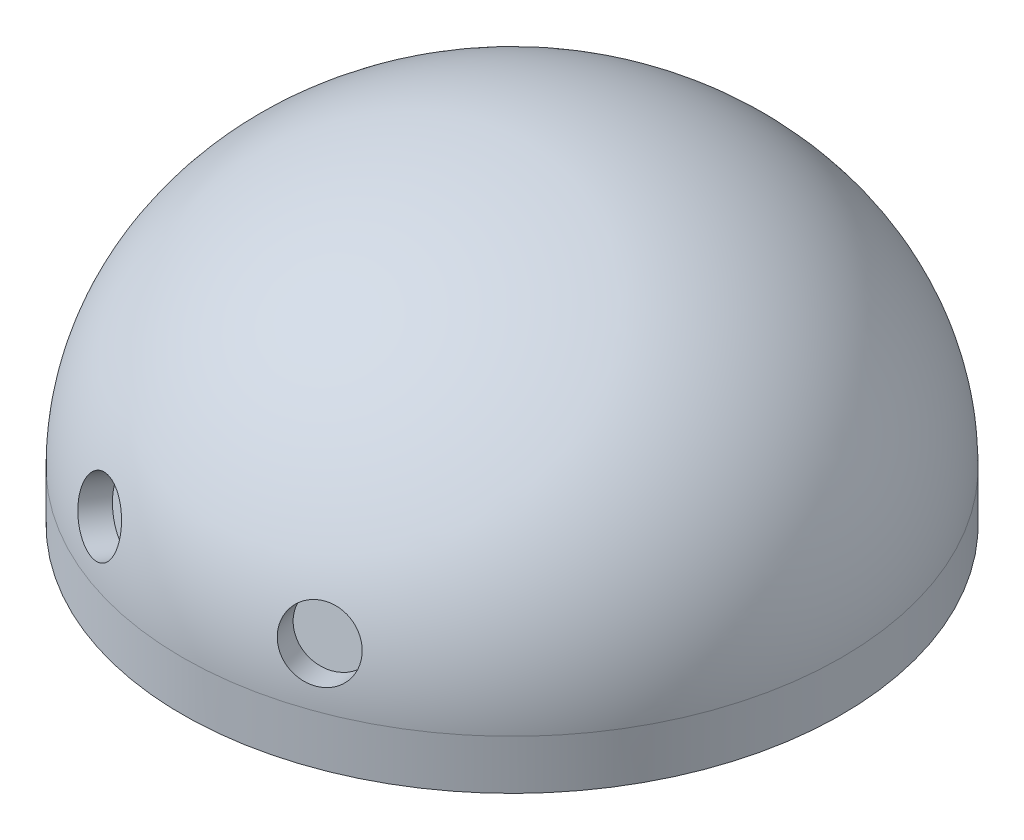
ISO-10303-21;
HEADER;
FILE_DESCRIPTION(('STEP AP214'),'2;1');
FILE_NAME('part.step','',(''),(''),'','','');
FILE_SCHEMA(('AUTOMOTIVE_DESIGN { 1 0 10303 214 1 1 1 1 }'));
ENDSEC;
DATA;
#1=APPLICATION_CONTEXT('core data for automotive mechanical design processes');
#2=APPLICATION_PROTOCOL_DEFINITION('international standard','automotive_design',2000,#1);
#3=PRODUCT_CONTEXT('',#1,'mechanical');
#4=PRODUCT('Part','Part','',(#3));
#5=PRODUCT_RELATED_PRODUCT_CATEGORY('part','',(#4));
#6=PRODUCT_DEFINITION_FORMATION('','',#4);
#7=PRODUCT_DEFINITION_CONTEXT('part definition',#1,'design');
#8=PRODUCT_DEFINITION('design','',#6,#7);
#9=PRODUCT_DEFINITION_SHAPE('','',#8);
#10=(LENGTH_UNIT() NAMED_UNIT(*) SI_UNIT(.MILLI.,.METRE.));
#11=(NAMED_UNIT(*) PLANE_ANGLE_UNIT() SI_UNIT($,.RADIAN.));
#12=(NAMED_UNIT(*) SI_UNIT($,.STERADIAN.) SOLID_ANGLE_UNIT());
#13=UNCERTAINTY_MEASURE_WITH_UNIT(LENGTH_MEASURE(1.E-05),#10,'distance_accuracy_value','');
#14=(GEOMETRIC_REPRESENTATION_CONTEXT(3) GLOBAL_UNCERTAINTY_ASSIGNED_CONTEXT((#13)) GLOBAL_UNIT_ASSIGNED_CONTEXT((#10,
#11,#12)) REPRESENTATION_CONTEXT('',''));
#15=CARTESIAN_POINT('',(0.,0.,0.));
#16=DIRECTION('',(0.,0.,1.));
#17=DIRECTION('',(1.,0.,0.));
#18=AXIS2_PLACEMENT_3D('',#15,#16,#17);
#19=CARTESIAN_POINT('',(0.,0.,0.));
#20=DIRECTION('',(0.,0.,1.));
#21=DIRECTION('',(-1.,0.,0.));
#22=AXIS2_PLACEMENT_3D('',#19,#20,#21);
#23=ELLIPSE('',#22,20.,17.);
#24=TRIMMED_CURVE('',#23,(PARAMETER_VALUE(1.5707963267949)),(PARAMETER_VALUE(4.71238898038469)),
.T.,.PARAMETER.);
#25=CARTESIAN_POINT('',(0.,26.6773564906992,0.));
#26=DIRECTION('',(0.,1.,0.));
#27=AXIS1_PLACEMENT('',#25,#26);
#28=SURFACE_OF_REVOLUTION('',#24,#27);
#29=CARTESIAN_POINT('',(-4.80098950316845,3.23633692495747,19.0382190513201));
#30=CARTESIAN_POINT('',(-4.80959540317422,3.12667561615685,19.0618491943308));
#31=CARTESIAN_POINT('',(-4.82699783108092,3.01685802759355,19.0819314643858));
#32=CARTESIAN_POINT('',(-4.87896923787384,2.80009315749065,19.1144177679186));
#33=CARTESIAN_POINT('',(-4.91355816951812,2.69314936477069,19.1268128392135));
#34=CARTESIAN_POINT('',(-4.99895945219169,2.48531823522831,19.1436156205902));
#35=CARTESIAN_POINT('',(-5.04976544014632,2.3844285413778,19.1480264589191));
#36=CARTESIAN_POINT('',(-5.16620453013257,2.19160241980392,19.1488556132407));
#37=CARTESIAN_POINT('',(-5.23183402334872,2.09966382069961,19.1452758726767));
#38=CARTESIAN_POINT('',(-5.37604174479478,1.92746208288544,19.1303856960292));
#39=CARTESIAN_POINT('',(-5.45460548764444,1.84718607016551,19.1190838639983));
#40=CARTESIAN_POINT('',(-5.62256710888655,1.70050711895076,19.0892398674682));
#41=CARTESIAN_POINT('',(-5.71196536103795,1.63410465926839,19.070697453141));
#42=CARTESIAN_POINT('',(-5.89905002658007,1.51713736052638,19.0270705320031));
#43=CARTESIAN_POINT('',(-5.99673102689248,1.46656227755381,19.0019902760133));
#44=CARTESIAN_POINT('',(-6.1977067148132,1.38265504704791,18.9461275632921));
#45=CARTESIAN_POINT('',(-6.30100138929607,1.34932285920048,18.9153451198926));
#46=CARTESIAN_POINT('',(-6.51030403472964,1.30086702001827,18.8490473313743));
#47=CARTESIAN_POINT('',(-6.61631193973145,1.28574292653855,18.8135321012044));
#48=CARTESIAN_POINT('',(-6.82805060211161,1.27413975370741,18.7388209621598));
#49=CARTESIAN_POINT('',(-6.93378135986938,1.27766064881692,18.6996250583267));
#50=CARTESIAN_POINT('',(-7.14196666092716,1.30324613545661,18.6186523671144));
#51=CARTESIAN_POINT('',(-7.24442102747307,1.32531172568644,18.5768754408499));
#52=CARTESIAN_POINT('',(-7.44311563697539,1.38734891657614,18.4918641283314));
#53=CARTESIAN_POINT('',(-7.53935587582237,1.42732052907719,18.4486297411136));
#54=CARTESIAN_POINT('',(-7.7228469054888,1.5240111118677,18.3618213130276));
#55=CARTESIAN_POINT('',(-7.81009794318364,1.58072962206236,18.3182472815226));
#56=CARTESIAN_POINT('',(-7.97308422617122,1.709272938722,18.2318509950134));
#57=CARTESIAN_POINT('',(-8.0488194958063,1.78109771325419,18.1890287384203));
#58=CARTESIAN_POINT('',(-8.18656472760909,1.93777339872484,18.1051915639556));
#59=CARTESIAN_POINT('',(-8.2485753431043,2.02262368929075,18.0641765601287));
#60=CARTESIAN_POINT('',(-8.35706403627015,2.2029044701538,17.9849540249972));
#61=CARTESIAN_POINT('',(-8.40354212302428,2.29833495426359,17.9467464920507));
#62=CARTESIAN_POINT('',(-8.47962031967518,2.49706284718879,17.8740669211108));
#63=CARTESIAN_POINT('',(-8.50921511121206,2.60036272331678,17.8395960629634));
#64=CARTESIAN_POINT('',(-8.55064464821126,2.81184480119984,17.7752693431589));
#65=CARTESIAN_POINT('',(-8.56247928989088,2.92002703148149,17.7454135084709));
#66=CARTESIAN_POINT('',(-8.56805693476744,3.1383366961746,17.6910600953594));
#67=CARTESIAN_POINT('',(-8.56177658410125,3.24846645950148,17.6665694775565));
#68=CARTESIAN_POINT('',(-8.5312703392749,3.46741794287104,17.6236743063997));
#69=CARTESIAN_POINT('',(-8.50704419536231,3.57623964468796,17.605269837752));
#70=CARTESIAN_POINT('',(-8.44129144533647,3.7897454242458,17.5750756209244));
#71=CARTESIAN_POINT('',(-8.3997278973306,3.89442014112061,17.5633001241497));
#72=CARTESIAN_POINT('',(-8.30051232073934,4.09644777214587,17.5468519608923));
#73=CARTESIAN_POINT('',(-8.24286009661763,4.19380059729026,17.5421793807404));
#74=CARTESIAN_POINT('',(-8.11304984342132,4.37858574153657,17.5402057977305));
#75=CARTESIAN_POINT('',(-8.04087202170919,4.46600426701914,17.5429149170586));
#76=CARTESIAN_POINT('',(-7.88415026794589,4.62830732330704,17.5558171991381));
#77=CARTESIAN_POINT('',(-7.79960638321813,4.70319190207589,17.5660103332498));
#78=CARTESIAN_POINT('',(-7.62072173004331,4.83821620680083,17.5937490504916));
#79=CARTESIAN_POINT('',(-7.52639448886805,4.89837591560588,17.6112845807438));
#80=CARTESIAN_POINT('',(-7.33057693306861,5.00236840743723,17.6533722604964));
#81=CARTESIAN_POINT('',(-7.22908679305929,5.04620158830301,17.6779242389966));
#82=CARTESIAN_POINT('',(-7.02229510927559,5.11614305696886,17.7333643783293));
#83=CARTESIAN_POINT('',(-6.91701018417323,5.14232059931736,17.7642271563024));
#84=CARTESIAN_POINT('',(-6.70528450219197,5.17647440500713,17.8315498838362));
#85=CARTESIAN_POINT('',(-6.59884377105463,5.18445107287734,17.8680097089788));
#86=CARTESIAN_POINT('',(-6.3882363448893,5.18197803164763,17.9453710065624));
#87=CARTESIAN_POINT('',(-6.28406292993618,5.1715934967934,17.986256287202));
#88=CARTESIAN_POINT('',(-6.08054873822629,5.13282272232573,18.071379039537));
#89=CARTESIAN_POINT('',(-5.98120795413376,5.10443651003914,18.1156165061435));
#90=CARTESIAN_POINT('',(-5.79013613802305,5.03047278684316,18.2061049471179));
#91=CARTESIAN_POINT('',(-5.69840516668595,4.98489513886434,18.2523559375373));
#92=CARTESIAN_POINT('',(-5.52508271363666,4.87784023617426,18.345439758798));
#93=CARTESIAN_POINT('',(-5.44349102873356,4.81636330016024,18.392272577959));
#94=CARTESIAN_POINT('',(-5.29239995591901,4.67899751488044,18.4852154009012));
#95=CARTESIAN_POINT('',(-5.22294278859841,4.60306019480796,18.5313223922479));
#96=CARTESIAN_POINT('',(-5.09832000796762,4.43900975759113,18.6212044186813));
#97=CARTESIAN_POINT('',(-5.04315822097547,4.35089339024613,18.6649788269405));
#98=CARTESIAN_POINT('',(-4.94841628251511,4.16455123333564,18.7489852268321));
#99=CARTESIAN_POINT('',(-4.9089061491576,4.06628244117918,18.7892006887642));
#100=CARTESIAN_POINT('',(-4.84691756956675,3.86278351547748,18.8645704688974));
#101=CARTESIAN_POINT('',(-4.82441919971493,3.75756168271703,18.8997306684314));
#102=CARTESIAN_POINT('',(-4.80201542294444,3.58246551446891,18.9521539668904));
#103=CARTESIAN_POINT('',(-4.79685261126114,3.51376390359411,18.9712546963289));
#104=CARTESIAN_POINT('',(-4.79360797183475,3.3755081655647,19.0067865900429));
#105=CARTESIAN_POINT('',(-4.7955261550444,3.3059540370916,19.0232177501892));
#106=CARTESIAN_POINT('',(-4.80098950316845,3.23633692495747,19.0382190513201));
#107=B_SPLINE_CURVE_WITH_KNOTS('',3,(#29,#30,#31,#32,#33,#34,#35,#36,#37,#38,#39,#40,#41,#42,
#43,#44,#45,#46,#47,#48,#49,#50,#51,#52,#53,#54,#55,#56,#57,#58,#59,#60,#61,#62,#63,#64,#65,#66,
#67,#68,#69,#70,#71,#72,#73,#74,#75,#76,#77,#78,#79,#80,#81,#82,#83,#84,#85,#86,#87,#88,#89,#90,
#91,#92,#93,#94,#95,#96,#97,#98,#99,#100,#101,#102,#103,#104,#105,#106),.UNSPECIFIED.,.T.,.F.,
(4,2,2,2,2,2,2,2,2,2,2,2,2,2,2,2,2,2,2,2,2,2,2,2,2,2,2,2,2,2,2,2,2,2,2,2,2,2,4),(0.,
0.337264104454084,0.674920675446971,1.01244492289715,1.34988708771531,1.68695388199132,
2.02403230739951,2.36089211301792,2.69775113105042,3.03460196901134,3.37145234556897,
3.7083208639136,4.04518960502851,4.38204909206334,4.71890786702564,5.05575060322634,
5.39259314244007,5.72954173097837,6.0664922884917,6.40387743702274,6.74126728104665,
7.0793797249679,7.4174962783723,7.75607670875897,8.09465584347413,8.43277291892214,
8.77088175470482,9.10765651723914,9.44442379461311,9.77999809394602,10.1155718838731,
10.4511483494281,10.7867180889585,11.1234331055888,11.4602381548827,11.7985333416567,
12.1364317119188,12.3505392847543,12.5646471887671),.UNSPECIFIED.);
#108=CARTESIAN_POINT('',(-4.80098950316845,3.23633692495747,19.0382190513201));
#109=VERTEX_POINT('',#108);
#110=EDGE_CURVE('E41',#109,#109,#107,.T.);
#111=ORIENTED_EDGE('',*,*,#110,.T.);
#112=EDGE_LOOP('',(#111));
#113=FACE_BOUND('',#112,.T.);
#114=CARTESIAN_POINT('',(0.,17.,0.));
#115=VERTEX_POINT('',#114);
#116=VERTEX_LOOP('',#115);
#117=FACE_BOUND('',#116,.T.);
#118=CARTESIAN_POINT('',(0.,0.,0.));
#119=DIRECTION('',(0.,-1.,0.));
#120=DIRECTION('',(0.,0.,-1.));
#121=AXIS2_PLACEMENT_3D('',#118,#119,#120);
#122=CIRCLE('',#121,20.);
#123=CARTESIAN_POINT('',(0.,0.,-20.));
#124=VERTEX_POINT('',#123);
#125=EDGE_CURVE('E48',#124,#124,#122,.T.);
#126=ORIENTED_EDGE('',*,*,#125,.F.);
#127=EDGE_LOOP('',(#126));
#128=FACE_BOUND('',#127,.T.);
#129=CARTESIAN_POINT('',(8.55975998631208,3.23633692495747,17.6701384780174));
#130=CARTESIAN_POINT('',(8.55112927809442,3.34630929284993,17.6464403653938));
#131=CARTESIAN_POINT('',(8.53341569743245,3.45628215086244,17.6256614947852));
#132=CARTESIAN_POINT('',(8.48031590063016,3.67304455997559,17.590580980276));
#133=CARTESIAN_POINT('',(8.44490820222992,3.77983007393635,17.576287250268));
#134=CARTESIAN_POINT('',(8.3574774730034,3.9870670349617,17.5546884554913));
#135=CARTESIAN_POINT('',(8.30546306039846,4.08752173515922,17.5473797736006));
#136=CARTESIAN_POINT('',(8.18634340969437,4.2793007136014,17.5400732592973));
#137=CARTESIAN_POINT('',(8.11924190601367,4.3706272432211,17.5400736197084));
#138=CARTESIAN_POINT('',(7.97184659296114,4.54166310903569,17.5475402976013));
#139=CARTESIAN_POINT('',(7.89154619329334,4.62136660406212,17.5550103542724));
#140=CARTESIAN_POINT('',(7.72009692906656,4.76685411693606,17.5773868733833));
#141=CARTESIAN_POINT('',(7.62894775365841,4.83263773578829,17.592293548943));
#142=CARTESIAN_POINT('',(7.43867065775511,4.94827314074961,17.629246532952));
#143=CARTESIAN_POINT('',(7.33956220473779,4.99816240099378,17.6512757974156));
#144=CARTESIAN_POINT('',(7.13604517273159,5.08079388096732,17.7020015195663));
#145=CARTESIAN_POINT('',(7.03163674350444,5.11353658491238,17.7306977889452));
#146=CARTESIAN_POINT('',(6.82098909589844,5.16083107021719,17.7939036895879));
#147=CARTESIAN_POINT('',(6.71475947377887,5.1754591067068,17.8283882529116));
#148=CARTESIAN_POINT('',(6.50308879009155,5.18635608175249,17.9023176849766));
#149=CARTESIAN_POINT('',(6.39764771204886,5.18262540495338,17.9417624497766));
#150=CARTESIAN_POINT('',(6.19083497484809,5.15694778141336,18.0243639874354));
#151=CARTESIAN_POINT('',(6.08945326135455,5.13504919027714,18.0675106343681));
#152=CARTESIAN_POINT('',(5.89330795902842,5.07372498941664,18.1563155779785));
#153=CARTESIAN_POINT('',(5.79854440672582,5.03429928295749,18.2019738885173));
#154=CARTESIAN_POINT('',(5.61814144143331,4.9389773877253,18.2944606972607));
#155=CARTESIAN_POINT('',(5.53251404836572,4.88305985676552,18.3412906393662));
#156=CARTESIAN_POINT('',(5.37286322196202,4.75634835318188,18.4346016595438));
#157=CARTESIAN_POINT('',(5.29884004430351,4.68555405285609,18.4810827299076));
#158=CARTESIAN_POINT('',(5.16411975198203,4.53074932257937,18.5724206878891));
#159=CARTESIAN_POINT('',(5.1034779793104,4.44668638574274,18.6172702125613));
#160=CARTESIAN_POINT('',(4.9975349754279,4.26790088626344,18.703725100895));
#161=CARTESIAN_POINT('',(4.95223406157038,4.1731781031566,18.7453303974301));
#162=CARTESIAN_POINT('',(4.87806151344166,3.97537745196328,18.8241201920181));
#163=CARTESIAN_POINT('',(4.84924566982312,3.87227254473113,18.8612893448953));
#164=CARTESIAN_POINT('',(4.80905936766319,3.66088125730855,18.9298820706926));
#165=CARTESIAN_POINT('',(4.7976889804716,3.55259485592829,18.9613056201134));
#166=CARTESIAN_POINT('',(4.7927062210593,3.33384906410547,19.0174621005141));
#167=CARTESIAN_POINT('',(4.79910137824493,3.22338877202133,19.0421921897924));
#168=CARTESIAN_POINT('',(4.82950159305786,3.00348252015817,19.0842247825943));
#169=CARTESIAN_POINT('',(4.85350648567941,2.89403655088452,19.1015273557124));
#170=CARTESIAN_POINT('',(4.91841981031802,2.67949271828915,19.1282252529755));
#171=CARTESIAN_POINT('',(4.95929717041724,2.57438725097181,19.1376350162398));
#172=CARTESIAN_POINT('',(5.05684151987301,2.37133470491363,19.1484207375639));
#173=CARTESIAN_POINT('',(5.11350833664283,2.2733875479436,19.1497967834326));
#174=CARTESIAN_POINT('',(5.24094948734891,2.08766763769706,19.1446101367496));
#175=CARTESIAN_POINT('',(5.31169560225233,1.99987507939896,19.1380631929269));
#176=CARTESIAN_POINT('',(5.46541818971351,1.83677667326187,19.1173973183714));
#177=CARTESIAN_POINT('',(5.54839460186325,1.76147076375259,19.1032784250373));
#178=CARTESIAN_POINT('',(5.72419597951362,1.62559102580799,19.0680490510578));
#179=CARTESIAN_POINT('',(5.81701153995388,1.56500330769772,19.04694520696));
#180=CARTESIAN_POINT('',(6.0099757634624,1.46022073165664,18.99849171165));
#181=CARTESIAN_POINT('',(6.11012441155149,1.41602584024159,18.9711420731959));
#182=CARTESIAN_POINT('',(6.31494032456792,1.34531358963673,18.9110983487516));
#183=CARTESIAN_POINT('',(6.41960694389294,1.31879371359445,18.8784050245071));
#184=CARTESIAN_POINT('',(6.6305293376825,1.28418918474635,18.8086757957119));
#185=CARTESIAN_POINT('',(6.73678511547949,1.2761045706046,18.7716398820535));
#186=CARTESIAN_POINT('',(6.94788472718725,1.278604890463,18.6942984799445));
#187=CARTESIAN_POINT('',(7.05272847763701,1.28919092319557,18.6539927992073));
#188=CARTESIAN_POINT('',(7.25801025140401,1.32872813478487,18.5712263893355));
#189=CARTESIAN_POINT('',(7.35844826597479,1.35767935009925,18.5287656559229));
#190=CARTESIAN_POINT('',(7.55203851972821,1.43310924169361,18.4428106112993));
#191=CARTESIAN_POINT('',(7.64519062231531,1.47958824648777,18.3993162807305));
#192=CARTESIAN_POINT('',(7.82151307268747,1.58872618413935,18.3124060031481));
#193=CARTESIAN_POINT('',(7.90468382116393,1.65138446717745,18.2689900530571));
#194=CARTESIAN_POINT('',(8.05861913280082,1.79105647958825,18.1833215545714));
#195=CARTESIAN_POINT('',(8.12938575321151,1.86806782409627,18.1410688142379));
#196=CARTESIAN_POINT('',(8.25648145596624,2.03425246928503,18.0587432806222));
#197=CARTESIAN_POINT('',(8.31280700985365,2.12342873414155,18.0186710219885));
#198=CARTESIAN_POINT('',(8.40938036822938,2.31140103422042,17.9416779520488));
#199=CARTESIAN_POINT('',(8.44961837516267,2.41020288615905,17.9047590719258));
#200=CARTESIAN_POINT('',(8.51275590926922,2.61447066004417,17.8350427985725));
#201=CARTESIAN_POINT('',(8.53567593785966,2.7199285415982,17.802240570457));
#202=CARTESIAN_POINT('',(8.5583875896391,2.89442870842842,17.7528946413004));
#203=CARTESIAN_POINT('',(8.56361605128094,2.96239027262053,17.7348485973259));
#204=CARTESIAN_POINT('',(8.56699656158374,3.09901346943209,17.7008685365715));
#205=CARTESIAN_POINT('',(8.56514861414542,3.16767510166561,17.6849345186274));
#206=CARTESIAN_POINT('',(8.55975998631208,3.23633692495747,17.6701384780174));
#207=B_SPLINE_CURVE_WITH_KNOTS('',3,(#129,#130,#131,#132,#133,#134,#135,#136,#137,#138,#139,
#140,#141,#142,#143,#144,#145,#146,#147,#148,#149,#150,#151,#152,#153,#154,#155,#156,#157,#158,
#159,#160,#161,#162,#163,#164,#165,#166,#167,#168,#169,#170,#171,#172,#173,#174,#175,#176,#177,
#178,#179,#180,#181,#182,#183,#184,#185,#186,#187,#188,#189,#190,#191,#192,#193,#194,#195,#196,
#197,#198,#199,#200,#201,#202,#203,#204,#205,#206),.UNSPECIFIED.,.T.,.F.,(4,2,2,2,2,2,2,2,2,2,2,
2,2,2,2,2,2,2,2,2,2,2,2,2,2,2,2,2,2,2,2,2,2,2,2,2,2,2,4),(0.,0.338224585015618,
0.676860806578078,1.01532157434485,1.35369865696897,1.69224520962233,2.03080146496135,
2.3685534954491,2.70629598736523,3.04261183851876,3.37892064333982,3.71433719171706,
4.04975559133338,4.38560997726873,4.72147176210002,5.05869758002844,5.39593037365537,
5.73429781808104,6.07266664638526,6.41117890429676,6.74968799034042,7.08757644825269,
7.42546121301829,7.76267545731497,8.09988803609525,8.43678113751925,8.77367355079657,
9.11051798166798,9.44736311899856,9.78422807969267,10.1210937091166,10.4579656525506,
10.7948240680725,11.1316265619583,11.4685112701935,11.8056008348325,12.1422907172282,
12.3534631229478,12.5646354122634),.UNSPECIFIED.);
#208=CARTESIAN_POINT('',(8.55975998631208,3.23633692495747,17.6701384780174));
#209=VERTEX_POINT('',#208);
#210=EDGE_CURVE('E61',#209,#209,#207,.T.);
#211=ORIENTED_EDGE('',*,*,#210,.F.);
#212=EDGE_LOOP('',(#211));
#213=FACE_BOUND('',#212,.T.);
#214=ADVANCED_FACE('F36',(#113,#117,#128,#213),#28,.T.);
#215=CARTESIAN_POINT('',(0.,-3.,0.));
#216=DIRECTION('',(0.,1.,0.));
#217=DIRECTION('',(0.,0.,1.));
#218=AXIS2_PLACEMENT_3D('',#215,#216,#217);
#219=CYLINDRICAL_SURFACE('',#218,20.);
#220=CARTESIAN_POINT('',(0.,-3.,0.));
#221=DIRECTION('',(0.,-1.,0.));
#222=DIRECTION('',(0.,0.,-1.));
#223=AXIS2_PLACEMENT_3D('',#220,#221,#222);
#224=CIRCLE('',#223,20.);
#225=CARTESIAN_POINT('',(0.,-3.,-20.));
#226=VERTEX_POINT('',#225);
#227=EDGE_CURVE('E11',#226,#226,#224,.T.);
#228=ORIENTED_EDGE('',*,*,#227,.F.);
#229=EDGE_LOOP('',(#228));
#230=FACE_BOUND('',#229,.T.);
#231=ORIENTED_EDGE('',*,*,#125,.T.);
#232=EDGE_LOOP('',(#231));
#233=FACE_BOUND('',#232,.T.);
#234=ADVANCED_FACE('F54',(#230,#233),#219,.T.);
#235=CARTESIAN_POINT('',(0.,-3.,0.));
#236=DIRECTION('',(0.,-1.,0.));
#237=DIRECTION('',(0.,0.,-1.));
#238=AXIS2_PLACEMENT_3D('',#235,#236,#237);
#239=PLANE('',#238);
#240=ORIENTED_EDGE('',*,*,#227,.T.);
#241=EDGE_LOOP('',(#240));
#242=FACE_BOUND('',#241,.T.);
#243=ADVANCED_FACE('F77',(#242),#239,.T.);
#244=CARTESIAN_POINT('',(6.13305046392286,2.97118327001772,16.8504176620037));
#245=DIRECTION('',(0.337419706756525,0.163464460888851,0.92705302519255));
#246=DIRECTION('',(0.939692620785908,0.,-0.34202014332567));
#247=AXIS2_PLACEMENT_3D('',#244,#245,#246);
#248=CYLINDRICAL_SURFACE('',#247,2.);
#249=CARTESIAN_POINT('',(6.13305046392286,2.97118327001772,16.8504176620037));
#250=DIRECTION('',(-0.337419706756525,-0.163464460888851,-0.92705302519255));
#251=DIRECTION('',(-0.939692620785908,0.,0.34202014332567));
#252=AXIS2_PLACEMENT_3D('',#249,#250,#251);
#253=CIRCLE('',#252,2.);
#254=CARTESIAN_POINT('',(4.25366522235105,2.97118327001772,17.534457948655));
#255=VERTEX_POINT('',#254);
#256=EDGE_CURVE('E63',#255,#255,#253,.T.);
#257=ORIENTED_EDGE('',*,*,#256,.T.);
#258=EDGE_LOOP('',(#257));
#259=FACE_BOUND('',#258,.T.);
#260=ORIENTED_EDGE('',*,*,#210,.T.);
#261=EDGE_LOOP('',(#260));
#262=FACE_BOUND('',#261,.T.);
#263=ADVANCED_FACE('F71',(#259,#262),#248,.F.);
#264=CARTESIAN_POINT('',(6.13305046392286,2.97118327001772,16.8504176620037));
#265=DIRECTION('',(-0.337419706756525,-0.163464460888851,-0.92705302519255));
#266=DIRECTION('',(-0.939692620785908,0.,0.34202014332567));
#267=AXIS2_PLACEMENT_3D('',#264,#265,#266);
#268=PLANE('',#267);
#269=ORIENTED_EDGE('',*,*,#256,.F.);
#270=EDGE_LOOP('',(#269));
#271=FACE_BOUND('',#270,.T.);
#272=ADVANCED_FACE('F76',(#271),#268,.F.);
#273=CARTESIAN_POINT('',(-6.13305046392286,2.97118327001772,16.8504176620037));
#274=DIRECTION('',(-0.337419706756525,0.163464460888851,0.92705302519255));
#275=DIRECTION('',(0.939692620785908,0.,0.34202014332567));
#276=AXIS2_PLACEMENT_3D('',#273,#274,#275);
#277=CYLINDRICAL_SURFACE('',#276,2.);
#278=CARTESIAN_POINT('',(-6.13305046392286,2.97118327001772,16.8504176620037));
#279=DIRECTION('',(-0.337419706756525,0.163464460888851,0.92705302519255));
#280=DIRECTION('',(0.939692620785908,0.,0.34202014332567));
#281=AXIS2_PLACEMENT_3D('',#278,#279,#280);
#282=CIRCLE('',#281,2.);
#283=CARTESIAN_POINT('',(-4.25366522235105,2.97118327001772,17.534457948655));
#284=VERTEX_POINT('',#283);
#285=EDGE_CURVE('E139',#284,#284,#282,.T.);
#286=ORIENTED_EDGE('',*,*,#285,.F.);
#287=EDGE_LOOP('',(#286));
#288=FACE_BOUND('',#287,.T.);
#289=ORIENTED_EDGE('',*,*,#110,.F.);
#290=EDGE_LOOP('',(#289));
#291=FACE_BOUND('',#290,.T.);
#292=ADVANCED_FACE('F103',(#288,#291),#277,.F.);
#293=CARTESIAN_POINT('',(-6.13305046392286,2.97118327001772,16.8504176620037));
#294=DIRECTION('',(0.337419706756525,-0.163464460888851,-0.92705302519255));
#295=DIRECTION('',(0.939692620785908,0.,0.34202014332567));
#296=AXIS2_PLACEMENT_3D('',#293,#294,#295);
#297=PLANE('',#296);
#298=ORIENTED_EDGE('',*,*,#285,.T.);
#299=EDGE_LOOP('',(#298));
#300=FACE_BOUND('',#299,.T.);
#301=ADVANCED_FACE('F110',(#300),#297,.F.);
#302=CLOSED_SHELL('',(#214,#234,#243,#263,#272,#292,#301));
#303=MANIFOLD_SOLID_BREP('B2',#302);
#304=ADVANCED_BREP_SHAPE_REPRESENTATION('',(#18,#303),#14);
#305=SHAPE_DEFINITION_REPRESENTATION(#9,#304);
ENDSEC;
END-ISO-10303-21;
